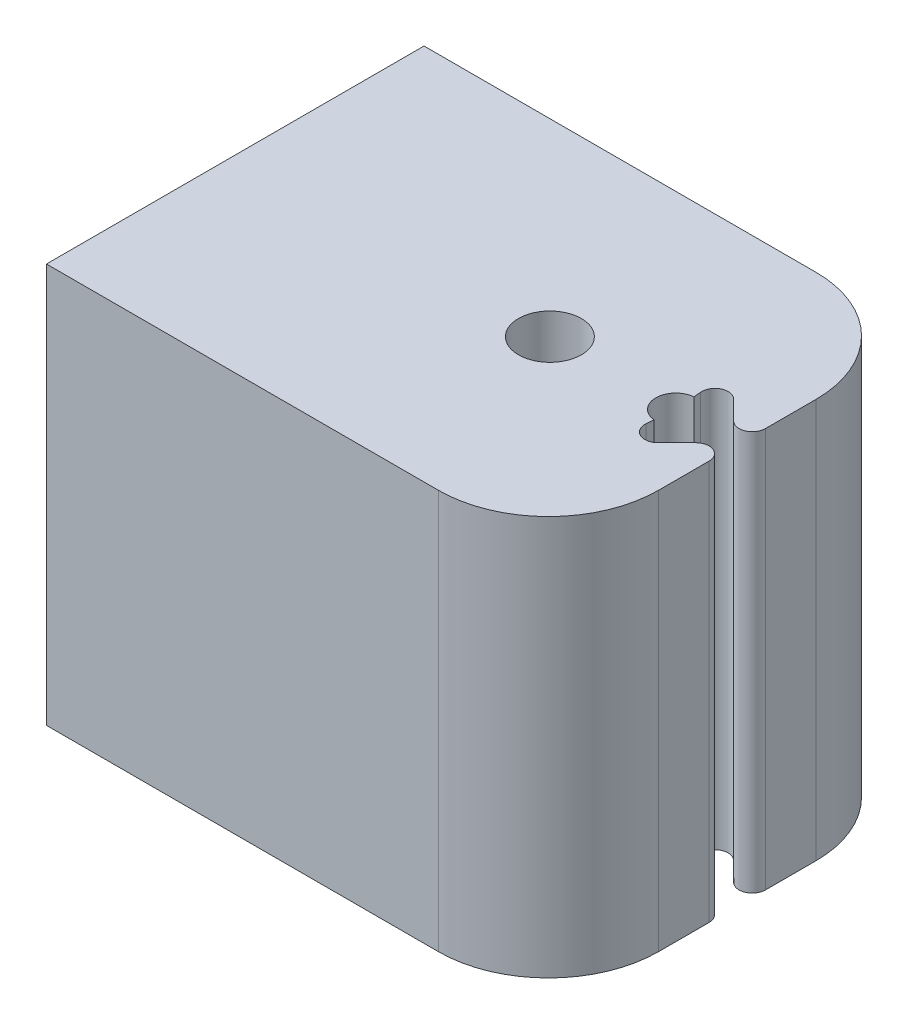
ISO-10303-21;
HEADER;
FILE_DESCRIPTION(('STEP AP214'),'2;1');
FILE_NAME('part.step','',(''),(''),'','','');
FILE_SCHEMA(('AUTOMOTIVE_DESIGN { 1 0 10303 214 1 1 1 1 }'));
ENDSEC;
DATA;
#1=APPLICATION_CONTEXT('core data for automotive mechanical design processes');
#2=APPLICATION_PROTOCOL_DEFINITION('international standard','automotive_design',2000,#1);
#3=PRODUCT_CONTEXT('',#1,'mechanical');
#4=PRODUCT('Part','Part','',(#3));
#5=PRODUCT_RELATED_PRODUCT_CATEGORY('part','',(#4));
#6=PRODUCT_DEFINITION_FORMATION('','',#4);
#7=PRODUCT_DEFINITION_CONTEXT('part definition',#1,'design');
#8=PRODUCT_DEFINITION('design','',#6,#7);
#9=PRODUCT_DEFINITION_SHAPE('','',#8);
#10=(LENGTH_UNIT() NAMED_UNIT(*) SI_UNIT(.MILLI.,.METRE.));
#11=(NAMED_UNIT(*) PLANE_ANGLE_UNIT() SI_UNIT($,.RADIAN.));
#12=(NAMED_UNIT(*) SI_UNIT($,.STERADIAN.) SOLID_ANGLE_UNIT());
#13=UNCERTAINTY_MEASURE_WITH_UNIT(LENGTH_MEASURE(1.E-05),#10,'distance_accuracy_value','');
#14=(GEOMETRIC_REPRESENTATION_CONTEXT(3) GLOBAL_UNCERTAINTY_ASSIGNED_CONTEXT((#13)) GLOBAL_UNIT_ASSIGNED_CONTEXT((#10,
#11,#12)) REPRESENTATION_CONTEXT('',''));
#15=CARTESIAN_POINT('',(0.,0.,0.));
#16=DIRECTION('',(0.,0.,1.));
#17=DIRECTION('',(1.,0.,0.));
#18=AXIS2_PLACEMENT_3D('',#15,#16,#17);
#19=CARTESIAN_POINT('',(-8.,12.7,0.));
#20=DIRECTION('',(0.,-1.,0.));
#21=DIRECTION('',(0.,0.,-1.));
#22=AXIS2_PLACEMENT_3D('',#19,#20,#21);
#23=CYLINDRICAL_SURFACE('',#22,1.);
#24=CARTESIAN_POINT('',(-8.,12.7,0.));
#25=DIRECTION('',(0.,1.,0.));
#26=DIRECTION('',(0.,0.,1.));
#27=AXIS2_PLACEMENT_3D('',#24,#25,#26);
#28=CIRCLE('',#27,1.);
#29=CARTESIAN_POINT('',(-8.,12.7,1.));
#30=VERTEX_POINT('',#29);
#31=EDGE_CURVE('E206',#30,#30,#28,.T.);
#32=ORIENTED_EDGE('',*,*,#31,.T.);
#33=EDGE_LOOP('',(#32));
#34=FACE_BOUND('',#33,.T.);
#35=CARTESIAN_POINT('',(-8.,0.,0.));
#36=DIRECTION('',(0.,1.,0.));
#37=DIRECTION('',(0.,0.,1.));
#38=AXIS2_PLACEMENT_3D('',#35,#36,#37);
#39=CIRCLE('',#38,1.);
#40=CARTESIAN_POINT('',(-8.,0.,1.));
#41=VERTEX_POINT('',#40);
#42=EDGE_CURVE('E347',#41,#41,#39,.T.);
#43=ORIENTED_EDGE('',*,*,#42,.F.);
#44=EDGE_LOOP('',(#43));
#45=FACE_BOUND('',#44,.T.);
#46=CARTESIAN_POINT('',(-8.,10.2229833462074,-1.));
#47=CARTESIAN_POINT('',(-8.02766298510654,10.2229814858018,-1.00000033749611));
#48=CARTESIAN_POINT('',(-8.05531226301823,10.2232800994947,-0.998851407375367));
#49=CARTESIAN_POINT('',(-8.11040403530357,10.2244590477456,-0.994271295395754));
#50=CARTESIAN_POINT('',(-8.13784656368709,10.2253392844169,-0.990840497572679));
#51=CARTESIAN_POINT('',(-8.21945317320884,10.2288171097205,-0.977175239382527));
#52=CARTESIAN_POINT('',(-8.27305646848221,10.2322520314881,-0.963567695172493));
#53=CARTESIAN_POINT('',(-8.37712467378197,10.24095422588,-0.927798076247997));
#54=CARTESIAN_POINT('',(-8.42758987821286,10.2462213263093,-0.905636805423836));
#55=CARTESIAN_POINT('',(-8.52411144864733,10.2579913447194,-0.853415378025865));
#56=CARTESIAN_POINT('',(-8.57016662789097,10.2644945939565,-0.823353103356932));
#57=CARTESIAN_POINT('',(-8.6575438819061,10.2781626239803,-0.755484471828068));
#58=CARTESIAN_POINT('',(-8.69875488624552,10.2853379102892,-0.717537268783975));
#59=CARTESIAN_POINT('',(-8.77430208948271,10.2994510439619,-0.635275780516229));
#60=CARTESIAN_POINT('',(-8.80863718946794,10.3063888532254,-0.59096047947883));
#61=CARTESIAN_POINT('',(-8.86991100161864,10.3193618228325,-0.49645689940169));
#62=CARTESIAN_POINT('',(-8.89673989598397,10.3253830468173,-0.446195340334473));
#63=CARTESIAN_POINT('',(-8.94152473419671,10.3357234625059,-0.341702590842918));
#64=CARTESIAN_POINT('',(-8.95948242429983,10.340042989147,-0.287472184083008));
#65=CARTESIAN_POINT('',(-8.98565899277744,10.3464190000513,-0.177744108525159));
#66=CARTESIAN_POINT('',(-8.99406767242282,10.348519529013,-0.122294322002856));
#67=CARTESIAN_POINT('',(-9.0015033715433,10.3503743815082,-0.0107327756816777));
#68=CARTESIAN_POINT('',(-9.00053157019234,10.3501289999344,0.0453789000287075));
#69=CARTESIAN_POINT('',(-8.98937003631455,10.3473523736574,0.155352492972098));
#70=CARTESIAN_POINT('',(-8.97938538340052,10.3448719867736,0.209236701739857));
#71=CARTESIAN_POINT('',(-8.95081132081725,10.337963306365,0.314538711084342));
#72=CARTESIAN_POINT('',(-8.93222153043142,10.3335349266556,0.36595640242399));
#73=CARTESIAN_POINT('',(-8.88679871932935,10.323149977618,0.465407286024541));
#74=CARTESIAN_POINT('',(-8.85989260576716,10.3171799382756,0.51340562960225));
#75=CARTESIAN_POINT('',(-8.79865687016653,10.3043594554192,0.604276631230016));
#76=CARTESIAN_POINT('',(-8.76432612974678,10.297508879332,0.64714851556229));
#77=CARTESIAN_POINT('',(-8.68812108791869,10.2834556602287,0.727769389708492));
#78=CARTESIAN_POINT('',(-8.64606836346019,10.2762485047769,0.765349103054129));
#79=CARTESIAN_POINT('',(-8.55617013307227,10.2624616828401,0.83296957518624));
#80=CARTESIAN_POINT('',(-8.50832304671644,10.2558821884299,0.863008270245064));
#81=CARTESIAN_POINT('',(-8.40785440217623,10.2440781358633,0.914804709285964));
#82=CARTESIAN_POINT('',(-8.35520853510392,10.2388610600914,0.936517017887271));
#83=CARTESIAN_POINT('',(-8.24688307158172,10.2304705880706,0.970702351849831));
#84=CARTESIAN_POINT('',(-8.19120814485016,10.2272941376144,0.983189189212134));
#85=CARTESIAN_POINT('',(-8.1125426192411,10.2245529068152,0.99390463515094));
#86=CARTESIAN_POINT('',(-8.09008029678682,10.2239652311086,0.99619079096671));
#87=CARTESIAN_POINT('',(-8.04508221009068,10.2231806248897,0.999236757697396));
#88=CARTESIAN_POINT('',(-8.02254662404471,10.2229830621946,0.999999038096048));
#89=CARTESIAN_POINT('',(-8.,10.2229833462074,1.));
#90=B_SPLINE_CURVE_WITH_KNOTS('',3,(#46,#47,#48,#49,#50,#51,#52,#53,#54,#55,#56,#57,#58,#59,#60,
#61,#62,#63,#64,#65,#66,#67,#68,#69,#70,#71,#72,#73,#74,#75,#76,#77,#78,#79,#80,#81,#82,#83,#84,
#85,#86,#87,#88,#89),.UNSPECIFIED.,.F.,.F.,(4,2,2,2,2,2,2,2,2,2,2,2,2,2,2,2,2,2,2,2,2,4),(0.,
0.082936530339771,0.165859106084653,0.331229963080318,0.496585282091501,0.661984974726752,
0.830641897427977,0.999325753539194,1.17036187098235,1.34136430732425,1.50890481515325,
1.67642426256639,1.84022545479276,2.00403389475838,2.16932509450377,2.33464120964329,
2.50441429534543,2.67423379180968,2.84496720161068,3.01544447539986,3.08315848722648,
3.15076267731672),.UNSPECIFIED.);
#91=CARTESIAN_POINT('',(-8.,10.2229833462074,-1.));
#92=VERTEX_POINT('',#91);
#93=CARTESIAN_POINT('',(-8.,10.2229833462074,1.));
#94=VERTEX_POINT('',#93);
#95=EDGE_CURVE('E307',#92,#94,#90,.T.);
#96=ORIENTED_EDGE('',*,*,#95,.F.);
#97=DIRECTION('',(0.,-1.,0.));
#98=VECTOR('',#97,1.);
#99=CARTESIAN_POINT('',(-8.,12.7,-1.));
#100=LINE('',#99,#98);
#101=CARTESIAN_POINT('',(-8.,2.47701665379258,-1.));
#102=VERTEX_POINT('',#101);
#103=EDGE_CURVE('E11',#92,#102,#100,.T.);
#104=ORIENTED_EDGE('',*,*,#103,.T.);
#105=CARTESIAN_POINT('',(-8.,2.47701665379258,1.));
#106=CARTESIAN_POINT('',(-8.02766298510654,2.47701851419823,1.00000033749611));
#107=CARTESIAN_POINT('',(-8.05531226301823,2.47671990050529,0.998851407375368));
#108=CARTESIAN_POINT('',(-8.11040403530357,2.47554095225441,0.994271295395756));
#109=CARTESIAN_POINT('',(-8.13784656368709,2.47466071558313,0.990840497572681));
#110=CARTESIAN_POINT('',(-8.21945317320884,2.47118289027946,0.977175239382528));
#111=CARTESIAN_POINT('',(-8.27305646848221,2.46774796851191,0.963567695172495));
#112=CARTESIAN_POINT('',(-8.37712467378197,2.45904577411997,0.927798076247999));
#113=CARTESIAN_POINT('',(-8.42758987821286,2.4537786736907,0.905636805423838));
#114=CARTESIAN_POINT('',(-8.52411144864733,2.44200865528061,0.853415378025867));
#115=CARTESIAN_POINT('',(-8.57016662789097,2.43550540604353,0.823353103356934));
#116=CARTESIAN_POINT('',(-8.6575438819061,2.42183737601975,0.75548447182807));
#117=CARTESIAN_POINT('',(-8.69875488624552,2.41466208971084,0.717537268783977));
#118=CARTESIAN_POINT('',(-8.77430208948271,2.40054895603806,0.635275780516231));
#119=CARTESIAN_POINT('',(-8.80863718946794,2.39361114677463,0.590960479478832));
#120=CARTESIAN_POINT('',(-8.86991100161864,2.38063817716752,0.496456899401692));
#121=CARTESIAN_POINT('',(-8.89673989598397,2.3746169531827,0.446195340334475));
#122=CARTESIAN_POINT('',(-8.94152473419671,2.36427653749411,0.34170259084292));
#123=CARTESIAN_POINT('',(-8.95948242429983,2.35995701085299,0.28747218408301));
#124=CARTESIAN_POINT('',(-8.98565899277744,2.35358099994872,0.17774410852516));
#125=CARTESIAN_POINT('',(-8.99406767242282,2.35148047098699,0.122294322002858));
#126=CARTESIAN_POINT('',(-9.0015033715433,2.34962561849184,0.0107327756816795));
#127=CARTESIAN_POINT('',(-9.00053157019234,2.34987100006555,-0.0453789000287058));
#128=CARTESIAN_POINT('',(-8.98937003631455,2.35264762634264,-0.155352492972096));
#129=CARTESIAN_POINT('',(-8.97938538340052,2.35512801322639,-0.209236701739855));
#130=CARTESIAN_POINT('',(-8.95081132081725,2.36203669363504,-0.31453871108434));
#131=CARTESIAN_POINT('',(-8.93222153043142,2.36646507334444,-0.365956402423988));
#132=CARTESIAN_POINT('',(-8.88679871932935,2.37685002238202,-0.465407286024539));
#133=CARTESIAN_POINT('',(-8.85989260576716,2.38282006172445,-0.513405629602248));
#134=CARTESIAN_POINT('',(-8.79865687016653,2.39564054458081,-0.604276631230014));
#135=CARTESIAN_POINT('',(-8.76432612974678,2.40249112066802,-0.647148515562289));
#136=CARTESIAN_POINT('',(-8.68812108791869,2.41654433977135,-0.727769389708491));
#137=CARTESIAN_POINT('',(-8.64606836346019,2.42375149522315,-0.765349103054127));
#138=CARTESIAN_POINT('',(-8.55617013307227,2.43753831715994,-0.832969575186238));
#139=CARTESIAN_POINT('',(-8.50832304671644,2.44411781157007,-0.863008270245062));
#140=CARTESIAN_POINT('',(-8.40785440217623,2.45592186413675,-0.914804709285962));
#141=CARTESIAN_POINT('',(-8.35520853510392,2.46113893990863,-0.93651701788727));
#142=CARTESIAN_POINT('',(-8.24688307158172,2.46952941192945,-0.970702351849829));
#143=CARTESIAN_POINT('',(-8.19120814485016,2.47270586238565,-0.983189189212132));
#144=CARTESIAN_POINT('',(-8.1125426192411,2.47544709318476,-0.993904635150938));
#145=CARTESIAN_POINT('',(-8.09008029678682,2.4760347688914,-0.996190790966708));
#146=CARTESIAN_POINT('',(-8.04508221009068,2.47681937511026,-0.999236757697394));
#147=CARTESIAN_POINT('',(-8.02254662404471,2.47701693780539,-0.999999038096046));
#148=CARTESIAN_POINT('',(-8.,2.47701665379258,-1.));
#149=B_SPLINE_CURVE_WITH_KNOTS('',3,(#105,#106,#107,#108,#109,#110,#111,#112,#113,#114,#115,
#116,#117,#118,#119,#120,#121,#122,#123,#124,#125,#126,#127,#128,#129,#130,#131,#132,#133,#134,
#135,#136,#137,#138,#139,#140,#141,#142,#143,#144,#145,#146,#147,#148),.UNSPECIFIED.,.F.,.F.,(4,
2,2,2,2,2,2,2,2,2,2,2,2,2,2,2,2,2,2,2,2,4),(0.,0.082936530339771,0.165859106084653,
0.331229963080318,0.496585282091501,0.661984974726752,0.830641897427976,0.999325753539194,
1.17036187098235,1.34136430732425,1.50890481515325,1.67642426256639,1.84022545479276,
2.00403389475838,2.16932509450377,2.33464120964329,2.50441429534543,2.67423379180968,
2.84496720161068,3.01544447539986,3.08315848722648,3.15076267731672),.UNSPECIFIED.);
#150=CARTESIAN_POINT('',(-8.,2.47701665379258,1.));
#151=VERTEX_POINT('',#150);
#152=EDGE_CURVE('E48',#151,#102,#149,.T.);
#153=ORIENTED_EDGE('',*,*,#152,.F.);
#154=DIRECTION('',(0.,-1.,0.));
#155=VECTOR('',#154,1.);
#156=CARTESIAN_POINT('',(-8.,12.7,1.));
#157=LINE('',#156,#155);
#158=EDGE_CURVE('E303',#151,#94,#157,.F.);
#159=ORIENTED_EDGE('',*,*,#158,.T.);
#160=EDGE_LOOP('',(#96,#104,#153,#159));
#161=FACE_BOUND('',#160,.T.);
#162=ADVANCED_FACE('F39',(#34,#45,#161),#23,.F.);
#163=CARTESIAN_POINT('',(-4.,12.7,0.));
#164=DIRECTION('',(0.,1.,0.));
#165=DIRECTION('',(0.,0.,1.));
#166=AXIS2_PLACEMENT_3D('',#163,#164,#165);
#167=PLANE('',#166);
#168=CARTESIAN_POINT('',(-4.,12.7,0.));
#169=DIRECTION('',(0.,-1.,0.));
#170=DIRECTION('',(0.,0.,1.));
#171=AXIS2_PLACEMENT_3D('',#168,#169,#170);
#172=CIRCLE('',#171,0.634999999999999);
#173=CARTESIAN_POINT('',(-4.05534389664477,12.7,0.632583633288258));
#174=VERTEX_POINT('',#173);
#175=CARTESIAN_POINT('',(-4.05534389664477,12.7,-0.632583633288257));
#176=VERTEX_POINT('',#175);
#177=EDGE_CURVE('E249',#174,#176,#172,.T.);
#178=ORIENTED_EDGE('',*,*,#177,.T.);
#179=DIRECTION('',(-0.0871557427476667,0.,-0.996194698091745));
#180=VECTOR('',#179,1.);
#181=CARTESIAN_POINT('',(-4.05534389664477,12.7,-0.632583633288257));
#182=LINE('',#181,#180);
#183=CARTESIAN_POINT('',(-4.07584445948414,12.7,-0.866906138778301));
#184=VERTEX_POINT('',#183);
#185=EDGE_CURVE('E129',#176,#184,#182,.T.);
#186=ORIENTED_EDGE('',*,*,#185,.T.);
#187=CARTESIAN_POINT('',(-3.65806528884882,12.7,-0.903457080066159));
#188=DIRECTION('',(0.,-1.,0.));
#189=DIRECTION('',(0.,0.,-1.));
#190=AXIS2_PLACEMENT_3D('',#187,#188,#189);
#191=CIRCLE('',#190,0.419375019196146);
#192=CARTESIAN_POINT('',(-3.36152236891499,12.7,-1.2));
#193=VERTEX_POINT('',#192);
#194=EDGE_CURVE('E375',#184,#193,#191,.T.);
#195=ORIENTED_EDGE('',*,*,#194,.T.);
#196=DIRECTION('',(0.707106781186565,0.,0.70710678118653));
#197=VECTOR('',#196,1.);
#198=CARTESIAN_POINT('',(-3.36152236891499,12.7,-1.2));
#199=LINE('',#198,#197);
#200=CARTESIAN_POINT('',(-2.76152236891496,12.7,-0.6));
#201=VERTEX_POINT('',#200);
#202=EDGE_CURVE('E378',#193,#201,#199,.T.);
#203=ORIENTED_EDGE('',*,*,#202,.T.);
#204=CARTESIAN_POINT('',(-2.46497944898113,12.7,-0.89654291993384));
#205=DIRECTION('',(0.,1.,0.));
#206=DIRECTION('',(0.,0.,1.));
#207=AXIS2_PLACEMENT_3D('',#204,#205,#206);
#208=CIRCLE('',#207,0.419375019196146);
#209=CARTESIAN_POINT('',(-2.04560442978499,12.7,-0.89654291993384));
#210=VERTEX_POINT('',#209);
#211=EDGE_CURVE('E381',#201,#210,#208,.T.);
#212=ORIENTED_EDGE('',*,*,#211,.T.);
#213=DIRECTION('',(0.,0.,-1.));
#214=VECTOR('',#213,1.);
#215=CARTESIAN_POINT('',(-2.04560442978499,12.7,-0.89654291993384));
#216=LINE('',#215,#214);
#217=CARTESIAN_POINT('',(-2.04560442978499,12.7,-2.5));
#218=VERTEX_POINT('',#217);
#219=EDGE_CURVE('E384',#210,#218,#216,.T.);
#220=ORIENTED_EDGE('',*,*,#219,.T.);
#221=CARTESIAN_POINT('',(-5.54560442978499,12.7,-2.5));
#222=DIRECTION('',(0.,1.,0.));
#223=DIRECTION('',(0.,0.,1.));
#224=AXIS2_PLACEMENT_3D('',#221,#222,#223);
#225=CIRCLE('',#224,3.5);
#226=CARTESIAN_POINT('',(-5.54560442978499,12.7,-6.));
#227=VERTEX_POINT('',#226);
#228=EDGE_CURVE('E387',#218,#227,#225,.T.);
#229=ORIENTED_EDGE('',*,*,#228,.T.);
#230=DIRECTION('',(-1.,0.,0.));
#231=VECTOR('',#230,1.);
#232=CARTESIAN_POINT('',(-5.54560442978499,12.7,-6.));
#233=LINE('',#232,#231);
#234=CARTESIAN_POINT('',(-18.,12.7,-6.));
#235=VERTEX_POINT('',#234);
#236=EDGE_CURVE('E390',#227,#235,#233,.T.);
#237=ORIENTED_EDGE('',*,*,#236,.T.);
#238=DIRECTION('',(0.,0.,1.));
#239=VECTOR('',#238,1.);
#240=CARTESIAN_POINT('',(-18.,12.7,-6.));
#241=LINE('',#240,#239);
#242=CARTESIAN_POINT('',(-18.,12.7,6.));
#243=VERTEX_POINT('',#242);
#244=EDGE_CURVE('E393',#235,#243,#241,.T.);
#245=ORIENTED_EDGE('',*,*,#244,.T.);
#246=DIRECTION('',(1.,0.,0.));
#247=VECTOR('',#246,1.);
#248=CARTESIAN_POINT('',(-18.,12.7,6.));
#249=LINE('',#248,#247);
#250=CARTESIAN_POINT('',(-5.54560442978499,12.7,6.));
#251=VERTEX_POINT('',#250);
#252=EDGE_CURVE('E396',#243,#251,#249,.T.);
#253=ORIENTED_EDGE('',*,*,#252,.T.);
#254=CARTESIAN_POINT('',(-5.54560442978499,12.7,2.5));
#255=DIRECTION('',(0.,1.,0.));
#256=DIRECTION('',(0.,0.,1.));
#257=AXIS2_PLACEMENT_3D('',#254,#255,#256);
#258=CIRCLE('',#257,3.5);
#259=CARTESIAN_POINT('',(-2.04560442978499,12.7,2.5));
#260=VERTEX_POINT('',#259);
#261=EDGE_CURVE('E399',#251,#260,#258,.T.);
#262=ORIENTED_EDGE('',*,*,#261,.T.);
#263=DIRECTION('',(0.,0.,-1.));
#264=VECTOR('',#263,1.);
#265=CARTESIAN_POINT('',(-2.04560442978499,12.7,0.896542919933841));
#266=LINE('',#265,#264);
#267=CARTESIAN_POINT('',(-2.04560442978499,12.7,0.896542919933841));
#268=VERTEX_POINT('',#267);
#269=EDGE_CURVE('E402',#260,#268,#266,.T.);
#270=ORIENTED_EDGE('',*,*,#269,.T.);
#271=CARTESIAN_POINT('',(-2.46497944898113,12.7,0.896542919933841));
#272=DIRECTION('',(0.,1.,0.));
#273=DIRECTION('',(0.,0.,-1.));
#274=AXIS2_PLACEMENT_3D('',#271,#272,#273);
#275=CIRCLE('',#274,0.419375019196146);
#276=CARTESIAN_POINT('',(-2.76152236891496,12.7,0.6));
#277=VERTEX_POINT('',#276);
#278=EDGE_CURVE('E176',#268,#277,#275,.T.);
#279=ORIENTED_EDGE('',*,*,#278,.T.);
#280=DIRECTION('',(-0.707106781186565,0.,0.70710678118653));
#281=VECTOR('',#280,1.);
#282=CARTESIAN_POINT('',(-3.36152236891499,12.7,1.2));
#283=LINE('',#282,#281);
#284=CARTESIAN_POINT('',(-3.36152236891499,12.7,1.2));
#285=VERTEX_POINT('',#284);
#286=EDGE_CURVE('E168',#277,#285,#283,.T.);
#287=ORIENTED_EDGE('',*,*,#286,.T.);
#288=CARTESIAN_POINT('',(-3.65806528884882,12.7,0.903457080066159));
#289=DIRECTION('',(0.,-1.,0.));
#290=DIRECTION('',(0.,0.,1.));
#291=AXIS2_PLACEMENT_3D('',#288,#289,#290);
#292=CIRCLE('',#291,0.419375019196146);
#293=CARTESIAN_POINT('',(-4.07584445948414,12.7,0.866906138778302));
#294=VERTEX_POINT('',#293);
#295=EDGE_CURVE('E173',#285,#294,#292,.T.);
#296=ORIENTED_EDGE('',*,*,#295,.T.);
#297=DIRECTION('',(0.0871557427476667,0.,-0.996194698091745));
#298=VECTOR('',#297,1.);
#299=CARTESIAN_POINT('',(-4.05534389664477,12.7,0.632583633288258));
#300=LINE('',#299,#298);
#301=EDGE_CURVE('E63',#294,#174,#300,.T.);
#302=ORIENTED_EDGE('',*,*,#301,.T.);
#303=EDGE_LOOP('',(#178,#186,#195,#203,#212,#220,#229,#237,#245,#253,#262,#270,#279,#287,#296,#302));
#304=FACE_BOUND('',#303,.T.);
#305=ORIENTED_EDGE('',*,*,#31,.F.);
#306=EDGE_LOOP('',(#305));
#307=FACE_BOUND('',#306,.T.);
#308=ADVANCED_FACE('F170',(#304,#307),#167,.T.);
#309=CARTESIAN_POINT('',(-4.,0.,0.));
#310=DIRECTION('',(0.,1.,0.));
#311=DIRECTION('',(0.,0.,1.));
#312=AXIS2_PLACEMENT_3D('',#309,#310,#311);
#313=PLANE('',#312);
#314=CARTESIAN_POINT('',(-4.,0.,0.));
#315=DIRECTION('',(0.,-1.,0.));
#316=DIRECTION('',(0.,0.,1.));
#317=AXIS2_PLACEMENT_3D('',#314,#315,#316);
#318=CIRCLE('',#317,0.634999999999999);
#319=CARTESIAN_POINT('',(-4.05534389664477,0.,0.632583633288258));
#320=VERTEX_POINT('',#319);
#321=CARTESIAN_POINT('',(-4.05534389664477,0.,-0.632583633288257));
#322=VERTEX_POINT('',#321);
#323=EDGE_CURVE('E201',#320,#322,#318,.T.);
#324=ORIENTED_EDGE('',*,*,#323,.F.);
#325=DIRECTION('',(0.0871557427476667,0.,-0.996194698091745));
#326=VECTOR('',#325,1.);
#327=CARTESIAN_POINT('',(-4.05534389664477,0.,0.632583633288258));
#328=LINE('',#327,#326);
#329=CARTESIAN_POINT('',(-4.07584445948414,0.,0.866906138778302));
#330=VERTEX_POINT('',#329);
#331=EDGE_CURVE('E120',#330,#320,#328,.T.);
#332=ORIENTED_EDGE('',*,*,#331,.F.);
#333=CARTESIAN_POINT('',(-3.65806528884882,0.,0.903457080066159));
#334=DIRECTION('',(0.,-1.,0.));
#335=DIRECTION('',(0.,0.,1.));
#336=AXIS2_PLACEMENT_3D('',#333,#334,#335);
#337=CIRCLE('',#336,0.419375019196146);
#338=CARTESIAN_POINT('',(-3.36152236891499,0.,1.2));
#339=VERTEX_POINT('',#338);
#340=EDGE_CURVE('E244',#339,#330,#337,.T.);
#341=ORIENTED_EDGE('',*,*,#340,.F.);
#342=DIRECTION('',(-0.707106781186565,0.,0.70710678118653));
#343=VECTOR('',#342,1.);
#344=CARTESIAN_POINT('',(-3.36152236891499,0.,1.2));
#345=LINE('',#344,#343);
#346=CARTESIAN_POINT('',(-2.76152236891496,0.,0.6));
#347=VERTEX_POINT('',#346);
#348=EDGE_CURVE('E186',#347,#339,#345,.T.);
#349=ORIENTED_EDGE('',*,*,#348,.F.);
#350=CARTESIAN_POINT('',(-2.46497944898113,0.,0.896542919933841));
#351=DIRECTION('',(0.,1.,0.));
#352=DIRECTION('',(0.,0.,-1.));
#353=AXIS2_PLACEMENT_3D('',#350,#351,#352);
#354=CIRCLE('',#353,0.419375019196146);
#355=CARTESIAN_POINT('',(-2.04560442978499,0.,0.896542919933841));
#356=VERTEX_POINT('',#355);
#357=EDGE_CURVE('E239',#356,#347,#354,.T.);
#358=ORIENTED_EDGE('',*,*,#357,.F.);
#359=DIRECTION('',(0.,0.,-1.));
#360=VECTOR('',#359,1.);
#361=CARTESIAN_POINT('',(-2.04560442978499,0.,0.896542919933841));
#362=LINE('',#361,#360);
#363=CARTESIAN_POINT('',(-2.04560442978499,0.,2.5));
#364=VERTEX_POINT('',#363);
#365=EDGE_CURVE('E236',#364,#356,#362,.T.);
#366=ORIENTED_EDGE('',*,*,#365,.F.);
#367=CARTESIAN_POINT('',(-5.54560442978499,0.,2.5));
#368=DIRECTION('',(0.,1.,0.));
#369=DIRECTION('',(0.,0.,1.));
#370=AXIS2_PLACEMENT_3D('',#367,#368,#369);
#371=CIRCLE('',#370,3.5);
#372=CARTESIAN_POINT('',(-5.54560442978499,0.,6.));
#373=VERTEX_POINT('',#372);
#374=EDGE_CURVE('E233',#373,#364,#371,.T.);
#375=ORIENTED_EDGE('',*,*,#374,.F.);
#376=DIRECTION('',(1.,0.,0.));
#377=VECTOR('',#376,1.);
#378=CARTESIAN_POINT('',(-18.,0.,6.));
#379=LINE('',#378,#377);
#380=CARTESIAN_POINT('',(-18.,0.,6.));
#381=VERTEX_POINT('',#380);
#382=EDGE_CURVE('E230',#381,#373,#379,.T.);
#383=ORIENTED_EDGE('',*,*,#382,.F.);
#384=DIRECTION('',(0.,0.,1.));
#385=VECTOR('',#384,1.);
#386=CARTESIAN_POINT('',(-18.,0.,-6.));
#387=LINE('',#386,#385);
#388=CARTESIAN_POINT('',(-18.,0.,-6.));
#389=VERTEX_POINT('',#388);
#390=EDGE_CURVE('E227',#389,#381,#387,.T.);
#391=ORIENTED_EDGE('',*,*,#390,.F.);
#392=DIRECTION('',(-1.,0.,0.));
#393=VECTOR('',#392,1.);
#394=CARTESIAN_POINT('',(-5.54560442978499,0.,-6.));
#395=LINE('',#394,#393);
#396=CARTESIAN_POINT('',(-5.54560442978499,0.,-6.));
#397=VERTEX_POINT('',#396);
#398=EDGE_CURVE('E224',#397,#389,#395,.T.);
#399=ORIENTED_EDGE('',*,*,#398,.F.);
#400=CARTESIAN_POINT('',(-5.54560442978499,0.,-2.5));
#401=DIRECTION('',(0.,1.,0.));
#402=DIRECTION('',(0.,0.,1.));
#403=AXIS2_PLACEMENT_3D('',#400,#401,#402);
#404=CIRCLE('',#403,3.5);
#405=CARTESIAN_POINT('',(-2.04560442978499,0.,-2.5));
#406=VERTEX_POINT('',#405);
#407=EDGE_CURVE('E221',#406,#397,#404,.T.);
#408=ORIENTED_EDGE('',*,*,#407,.F.);
#409=DIRECTION('',(0.,0.,-1.));
#410=VECTOR('',#409,1.);
#411=CARTESIAN_POINT('',(-2.04560442978499,0.,-0.89654291993384));
#412=LINE('',#411,#410);
#413=CARTESIAN_POINT('',(-2.04560442978499,0.,-0.89654291993384));
#414=VERTEX_POINT('',#413);
#415=EDGE_CURVE('E218',#414,#406,#412,.T.);
#416=ORIENTED_EDGE('',*,*,#415,.F.);
#417=CARTESIAN_POINT('',(-2.46497944898113,0.,-0.89654291993384));
#418=DIRECTION('',(0.,1.,0.));
#419=DIRECTION('',(0.,0.,1.));
#420=AXIS2_PLACEMENT_3D('',#417,#418,#419);
#421=CIRCLE('',#420,0.419375019196146);
#422=CARTESIAN_POINT('',(-2.76152236891496,0.,-0.6));
#423=VERTEX_POINT('',#422);
#424=EDGE_CURVE('E215',#423,#414,#421,.T.);
#425=ORIENTED_EDGE('',*,*,#424,.F.);
#426=DIRECTION('',(0.707106781186565,0.,0.70710678118653));
#427=VECTOR('',#426,1.);
#428=CARTESIAN_POINT('',(-3.36152236891499,0.,-1.2));
#429=LINE('',#428,#427);
#430=CARTESIAN_POINT('',(-3.36152236891499,0.,-1.2));
#431=VERTEX_POINT('',#430);
#432=EDGE_CURVE('E212',#431,#423,#429,.T.);
#433=ORIENTED_EDGE('',*,*,#432,.F.);
#434=CARTESIAN_POINT('',(-3.65806528884882,0.,-0.903457080066159));
#435=DIRECTION('',(0.,-1.,0.));
#436=DIRECTION('',(0.,0.,-1.));
#437=AXIS2_PLACEMENT_3D('',#434,#435,#436);
#438=CIRCLE('',#437,0.419375019196146);
#439=CARTESIAN_POINT('',(-4.07584445948414,0.,-0.866906138778301));
#440=VERTEX_POINT('',#439);
#441=EDGE_CURVE('E209',#440,#431,#438,.T.);
#442=ORIENTED_EDGE('',*,*,#441,.F.);
#443=DIRECTION('',(-0.0871557427476667,0.,-0.996194698091745));
#444=VECTOR('',#443,1.);
#445=CARTESIAN_POINT('',(-4.05534389664477,0.,-0.632583633288257));
#446=LINE('',#445,#444);
#447=EDGE_CURVE('E205',#322,#440,#446,.T.);
#448=ORIENTED_EDGE('',*,*,#447,.F.);
#449=EDGE_LOOP('',(#324,#332,#341,#349,#358,#366,#375,#383,#391,#399,#408,#416,#425,#433,#442,#448));
#450=FACE_BOUND('',#449,.T.);
#451=ORIENTED_EDGE('',*,*,#42,.T.);
#452=EDGE_LOOP('',(#451));
#453=FACE_BOUND('',#452,.T.);
#454=ADVANCED_FACE('F340',(#450,#453),#313,.F.);
#455=CARTESIAN_POINT('',(-4.,12.7,0.));
#456=DIRECTION('',(0.,-1.,0.));
#457=DIRECTION('',(0.,0.,-1.));
#458=AXIS2_PLACEMENT_3D('',#455,#456,#457);
#459=CYLINDRICAL_SURFACE('',#458,0.634999999999999);
#460=ORIENTED_EDGE('',*,*,#323,.T.);
#461=DIRECTION('',(0.,-1.,0.));
#462=VECTOR('',#461,1.);
#463=CARTESIAN_POINT('',(-4.05534389664477,12.7,-0.632583633288257));
#464=LINE('',#463,#462);
#465=EDGE_CURVE('E300',#176,#322,#464,.T.);
#466=ORIENTED_EDGE('',*,*,#465,.F.);
#467=ORIENTED_EDGE('',*,*,#177,.F.);
#468=DIRECTION('',(0.,-1.,0.));
#469=VECTOR('',#468,1.);
#470=CARTESIAN_POINT('',(-4.05534389664477,12.7,0.632583633288258));
#471=LINE('',#470,#469);
#472=EDGE_CURVE('E197',#174,#320,#471,.T.);
#473=ORIENTED_EDGE('',*,*,#472,.T.);
#474=EDGE_LOOP('',(#460,#466,#467,#473));
#475=FACE_BOUND('',#474,.T.);
#476=ADVANCED_FACE('F41',(#475),#459,.F.);
#477=CARTESIAN_POINT('',(-4.05534389664477,12.7,-0.632583633288257));
#478=DIRECTION('',(-0.996194698091745,0.,0.0871557427476667));
#479=DIRECTION('',(0.0871557427476667,0.,0.996194698091745));
#480=AXIS2_PLACEMENT_3D('',#477,#478,#479);
#481=PLANE('',#480);
#482=ORIENTED_EDGE('',*,*,#447,.T.);
#483=DIRECTION('',(0.,-1.,0.));
#484=VECTOR('',#483,1.);
#485=CARTESIAN_POINT('',(-4.07584445948414,12.7,-0.866906138778301));
#486=LINE('',#485,#484);
#487=EDGE_CURVE('E296',#184,#440,#486,.T.);
#488=ORIENTED_EDGE('',*,*,#487,.F.);
#489=ORIENTED_EDGE('',*,*,#185,.F.);
#490=ORIENTED_EDGE('',*,*,#465,.T.);
#491=EDGE_LOOP('',(#482,#488,#489,#490));
#492=FACE_BOUND('',#491,.T.);
#493=ADVANCED_FACE('F423',(#492),#481,.F.);
#494=CARTESIAN_POINT('',(-3.65806528884882,12.7,-0.903457080066159));
#495=DIRECTION('',(0.,-1.,0.));
#496=DIRECTION('',(0.,0.,-1.));
#497=AXIS2_PLACEMENT_3D('',#494,#495,#496);
#498=CYLINDRICAL_SURFACE('',#497,0.419375019196146);
#499=ORIENTED_EDGE('',*,*,#441,.T.);
#500=DIRECTION('',(0.,-1.,0.));
#501=VECTOR('',#500,1.);
#502=CARTESIAN_POINT('',(-3.36152236891499,12.7,-1.2));
#503=LINE('',#502,#501);
#504=EDGE_CURVE('E292',#193,#431,#503,.T.);
#505=ORIENTED_EDGE('',*,*,#504,.F.);
#506=ORIENTED_EDGE('',*,*,#194,.F.);
#507=ORIENTED_EDGE('',*,*,#487,.T.);
#508=EDGE_LOOP('',(#499,#505,#506,#507));
#509=FACE_BOUND('',#508,.T.);
#510=ADVANCED_FACE('F426',(#509),#498,.F.);
#511=CARTESIAN_POINT('',(-3.36152236891499,12.7,-1.2));
#512=DIRECTION('',(0.707106781186529,0.,-0.707106781186565));
#513=DIRECTION('',(-0.707106781186566,0.,-0.70710678118653));
#514=AXIS2_PLACEMENT_3D('',#511,#512,#513);
#515=PLANE('',#514);
#516=ORIENTED_EDGE('',*,*,#432,.T.);
#517=DIRECTION('',(0.,-1.,0.));
#518=VECTOR('',#517,1.);
#519=CARTESIAN_POINT('',(-2.76152236891496,12.7,-0.6));
#520=LINE('',#519,#518);
#521=EDGE_CURVE('E288',#201,#423,#520,.T.);
#522=ORIENTED_EDGE('',*,*,#521,.F.);
#523=ORIENTED_EDGE('',*,*,#202,.F.);
#524=ORIENTED_EDGE('',*,*,#504,.T.);
#525=EDGE_LOOP('',(#516,#522,#523,#524));
#526=FACE_BOUND('',#525,.T.);
#527=ADVANCED_FACE('F431',(#526),#515,.F.);
#528=CARTESIAN_POINT('',(-2.46497944898113,12.7,-0.89654291993384));
#529=DIRECTION('',(0.,-1.,0.));
#530=DIRECTION('',(0.,0.,-1.));
#531=AXIS2_PLACEMENT_3D('',#528,#529,#530);
#532=CYLINDRICAL_SURFACE('',#531,0.419375019196146);
#533=ORIENTED_EDGE('',*,*,#424,.T.);
#534=DIRECTION('',(0.,-1.,0.));
#535=VECTOR('',#534,1.);
#536=CARTESIAN_POINT('',(-2.04560442978499,12.7,-0.89654291993384));
#537=LINE('',#536,#535);
#538=EDGE_CURVE('E284',#210,#414,#537,.T.);
#539=ORIENTED_EDGE('',*,*,#538,.F.);
#540=ORIENTED_EDGE('',*,*,#211,.F.);
#541=ORIENTED_EDGE('',*,*,#521,.T.);
#542=EDGE_LOOP('',(#533,#539,#540,#541));
#543=FACE_BOUND('',#542,.T.);
#544=ADVANCED_FACE('F437',(#543),#532,.T.);
#545=CARTESIAN_POINT('',(-2.04560442978499,12.7,-0.89654291993384));
#546=DIRECTION('',(-1.,0.,0.));
#547=DIRECTION('',(0.,0.,1.));
#548=AXIS2_PLACEMENT_3D('',#545,#546,#547);
#549=PLANE('',#548);
#550=ORIENTED_EDGE('',*,*,#415,.T.);
#551=DIRECTION('',(0.,-1.,0.));
#552=VECTOR('',#551,1.);
#553=CARTESIAN_POINT('',(-2.04560442978499,12.7,-2.5));
#554=LINE('',#553,#552);
#555=EDGE_CURVE('E280',#218,#406,#554,.T.);
#556=ORIENTED_EDGE('',*,*,#555,.F.);
#557=ORIENTED_EDGE('',*,*,#219,.F.);
#558=ORIENTED_EDGE('',*,*,#538,.T.);
#559=EDGE_LOOP('',(#550,#556,#557,#558));
#560=FACE_BOUND('',#559,.T.);
#561=ADVANCED_FACE('F441',(#560),#549,.F.);
#562=CARTESIAN_POINT('',(-5.54560442978499,12.7,-2.5));
#563=DIRECTION('',(0.,-1.,0.));
#564=DIRECTION('',(0.,0.,-1.));
#565=AXIS2_PLACEMENT_3D('',#562,#563,#564);
#566=CYLINDRICAL_SURFACE('',#565,3.5);
#567=ORIENTED_EDGE('',*,*,#407,.T.);
#568=DIRECTION('',(0.,-1.,0.));
#569=VECTOR('',#568,1.);
#570=CARTESIAN_POINT('',(-5.54560442978499,12.7,-6.));
#571=LINE('',#570,#569);
#572=EDGE_CURVE('E276',#227,#397,#571,.T.);
#573=ORIENTED_EDGE('',*,*,#572,.F.);
#574=ORIENTED_EDGE('',*,*,#228,.F.);
#575=ORIENTED_EDGE('',*,*,#555,.T.);
#576=EDGE_LOOP('',(#567,#573,#574,#575));
#577=FACE_BOUND('',#576,.T.);
#578=ADVANCED_FACE('F446',(#577),#566,.T.);
#579=CARTESIAN_POINT('',(-5.54560442978499,12.7,-6.));
#580=DIRECTION('',(0.,0.,1.));
#581=DIRECTION('',(1.,0.,0.));
#582=AXIS2_PLACEMENT_3D('',#579,#580,#581);
#583=PLANE('',#582);
#584=ORIENTED_EDGE('',*,*,#398,.T.);
#585=DIRECTION('',(0.,-1.,0.));
#586=VECTOR('',#585,1.);
#587=CARTESIAN_POINT('',(-18.,12.7,-6.));
#588=LINE('',#587,#586);
#589=EDGE_CURVE('E272',#235,#389,#588,.T.);
#590=ORIENTED_EDGE('',*,*,#589,.F.);
#591=ORIENTED_EDGE('',*,*,#236,.F.);
#592=ORIENTED_EDGE('',*,*,#572,.T.);
#593=EDGE_LOOP('',(#584,#590,#591,#592));
#594=FACE_BOUND('',#593,.T.);
#595=ADVANCED_FACE('F452',(#594),#583,.F.);
#596=CARTESIAN_POINT('',(-18.,12.7,-6.));
#597=DIRECTION('',(1.,0.,0.));
#598=DIRECTION('',(0.,0.,-1.));
#599=AXIS2_PLACEMENT_3D('',#596,#597,#598);
#600=PLANE('',#599);
#601=CARTESIAN_POINT('',(-18.,6.35,0.));
#602=DIRECTION('',(-1.,0.,0.));
#603=DIRECTION('',(0.,0.,1.));
#604=AXIS2_PLACEMENT_3D('',#601,#602,#603);
#605=CIRCLE('',#604,4.);
#606=CARTESIAN_POINT('',(-18.,6.35,4.));
#607=VERTEX_POINT('',#606);
#608=EDGE_CURVE('E364',#607,#607,#605,.T.);
#609=ORIENTED_EDGE('',*,*,#608,.F.);
#610=EDGE_LOOP('',(#609));
#611=FACE_BOUND('',#610,.T.);
#612=ORIENTED_EDGE('',*,*,#390,.T.);
#613=DIRECTION('',(0.,-1.,0.));
#614=VECTOR('',#613,1.);
#615=CARTESIAN_POINT('',(-18.,12.7,6.));
#616=LINE('',#615,#614);
#617=EDGE_CURVE('E268',#243,#381,#616,.T.);
#618=ORIENTED_EDGE('',*,*,#617,.F.);
#619=ORIENTED_EDGE('',*,*,#244,.F.);
#620=ORIENTED_EDGE('',*,*,#589,.T.);
#621=EDGE_LOOP('',(#612,#618,#619,#620));
#622=FACE_BOUND('',#621,.T.);
#623=ADVANCED_FACE('F456',(#611,#622),#600,.F.);
#624=CARTESIAN_POINT('',(-18.,12.7,6.));
#625=DIRECTION('',(0.,0.,-1.));
#626=DIRECTION('',(-1.,0.,0.));
#627=AXIS2_PLACEMENT_3D('',#624,#625,#626);
#628=PLANE('',#627);
#629=ORIENTED_EDGE('',*,*,#382,.T.);
#630=DIRECTION('',(0.,-1.,0.));
#631=VECTOR('',#630,1.);
#632=CARTESIAN_POINT('',(-5.54560442978499,12.7,6.));
#633=LINE('',#632,#631);
#634=EDGE_CURVE('E264',#251,#373,#633,.T.);
#635=ORIENTED_EDGE('',*,*,#634,.F.);
#636=ORIENTED_EDGE('',*,*,#252,.F.);
#637=ORIENTED_EDGE('',*,*,#617,.T.);
#638=EDGE_LOOP('',(#629,#635,#636,#637));
#639=FACE_BOUND('',#638,.T.);
#640=ADVANCED_FACE('F461',(#639),#628,.F.);
#641=CARTESIAN_POINT('',(-5.54560442978499,12.7,2.5));
#642=DIRECTION('',(0.,-1.,0.));
#643=DIRECTION('',(0.,0.,-1.));
#644=AXIS2_PLACEMENT_3D('',#641,#642,#643);
#645=CYLINDRICAL_SURFACE('',#644,3.5);
#646=ORIENTED_EDGE('',*,*,#374,.T.);
#647=DIRECTION('',(0.,-1.,0.));
#648=VECTOR('',#647,1.);
#649=CARTESIAN_POINT('',(-2.04560442978499,12.7,2.5));
#650=LINE('',#649,#648);
#651=EDGE_CURVE('E260',#260,#364,#650,.T.);
#652=ORIENTED_EDGE('',*,*,#651,.F.);
#653=ORIENTED_EDGE('',*,*,#261,.F.);
#654=ORIENTED_EDGE('',*,*,#634,.T.);
#655=EDGE_LOOP('',(#646,#652,#653,#654));
#656=FACE_BOUND('',#655,.T.);
#657=ADVANCED_FACE('F464',(#656),#645,.T.);
#658=CARTESIAN_POINT('',(-2.04560442978499,12.7,0.896542919933841));
#659=DIRECTION('',(-1.,0.,0.));
#660=DIRECTION('',(0.,0.,1.));
#661=AXIS2_PLACEMENT_3D('',#658,#659,#660);
#662=PLANE('',#661);
#663=ORIENTED_EDGE('',*,*,#365,.T.);
#664=DIRECTION('',(0.,-1.,0.));
#665=VECTOR('',#664,1.);
#666=CARTESIAN_POINT('',(-2.04560442978499,12.7,0.896542919933841));
#667=LINE('',#666,#665);
#668=EDGE_CURVE('E256',#268,#356,#667,.T.);
#669=ORIENTED_EDGE('',*,*,#668,.F.);
#670=ORIENTED_EDGE('',*,*,#269,.F.);
#671=ORIENTED_EDGE('',*,*,#651,.T.);
#672=EDGE_LOOP('',(#663,#669,#670,#671));
#673=FACE_BOUND('',#672,.T.);
#674=ADVANCED_FACE('F410',(#673),#662,.F.);
#675=CARTESIAN_POINT('',(-2.46497944898113,12.7,0.896542919933841));
#676=DIRECTION('',(0.,-1.,0.));
#677=DIRECTION('',(0.,0.,-1.));
#678=AXIS2_PLACEMENT_3D('',#675,#676,#677);
#679=CYLINDRICAL_SURFACE('',#678,0.419375019196146);
#680=ORIENTED_EDGE('',*,*,#357,.T.);
#681=DIRECTION('',(0.,-1.,0.));
#682=VECTOR('',#681,1.);
#683=CARTESIAN_POINT('',(-2.76152236891496,12.7,0.6));
#684=LINE('',#683,#682);
#685=EDGE_CURVE('E190',#277,#347,#684,.T.);
#686=ORIENTED_EDGE('',*,*,#685,.F.);
#687=ORIENTED_EDGE('',*,*,#278,.F.);
#688=ORIENTED_EDGE('',*,*,#668,.T.);
#689=EDGE_LOOP('',(#680,#686,#687,#688));
#690=FACE_BOUND('',#689,.T.);
#691=ADVANCED_FACE('F414',(#690),#679,.T.);
#692=CARTESIAN_POINT('',(-3.36152236891499,12.7,1.2));
#693=DIRECTION('',(0.70710678118653,0.,0.707106781186565));
#694=DIRECTION('',(0.707106781186565,0.,-0.70710678118653));
#695=AXIS2_PLACEMENT_3D('',#692,#693,#694);
#696=PLANE('',#695);
#697=ORIENTED_EDGE('',*,*,#348,.T.);
#698=DIRECTION('',(0.,-1.,0.));
#699=VECTOR('',#698,1.);
#700=CARTESIAN_POINT('',(-3.36152236891499,12.7,1.2));
#701=LINE('',#700,#699);
#702=EDGE_CURVE('E183',#285,#339,#701,.T.);
#703=ORIENTED_EDGE('',*,*,#702,.F.);
#704=ORIENTED_EDGE('',*,*,#286,.F.);
#705=ORIENTED_EDGE('',*,*,#685,.T.);
#706=EDGE_LOOP('',(#697,#703,#704,#705));
#707=FACE_BOUND('',#706,.T.);
#708=ADVANCED_FACE('F184',(#707),#696,.F.);
#709=CARTESIAN_POINT('',(-3.65806528884882,12.7,0.903457080066159));
#710=DIRECTION('',(0.,-1.,0.));
#711=DIRECTION('',(0.,0.,-1.));
#712=AXIS2_PLACEMENT_3D('',#709,#710,#711);
#713=CYLINDRICAL_SURFACE('',#712,0.419375019196146);
#714=ORIENTED_EDGE('',*,*,#340,.T.);
#715=DIRECTION('',(0.,-1.,0.));
#716=VECTOR('',#715,1.);
#717=CARTESIAN_POINT('',(-4.07584445948414,12.7,0.866906138778302));
#718=LINE('',#717,#716);
#719=EDGE_CURVE('E191',#294,#330,#718,.T.);
#720=ORIENTED_EDGE('',*,*,#719,.F.);
#721=ORIENTED_EDGE('',*,*,#295,.F.);
#722=ORIENTED_EDGE('',*,*,#702,.T.);
#723=EDGE_LOOP('',(#714,#720,#721,#722));
#724=FACE_BOUND('',#723,.T.);
#725=ADVANCED_FACE('F193',(#724),#713,.F.);
#726=CARTESIAN_POINT('',(-4.05534389664477,12.7,0.632583633288258));
#727=DIRECTION('',(-0.996194698091745,0.,-0.0871557427476667));
#728=DIRECTION('',(-0.0871557427476667,0.,0.996194698091745));
#729=AXIS2_PLACEMENT_3D('',#726,#727,#728);
#730=PLANE('',#729);
#731=ORIENTED_EDGE('',*,*,#331,.T.);
#732=ORIENTED_EDGE('',*,*,#472,.F.);
#733=ORIENTED_EDGE('',*,*,#301,.F.);
#734=ORIENTED_EDGE('',*,*,#719,.T.);
#735=EDGE_LOOP('',(#731,#732,#733,#734));
#736=FACE_BOUND('',#735,.T.);
#737=ADVANCED_FACE('F333',(#736),#730,.F.);
#738=CARTESIAN_POINT('',(-8.,6.35,0.));
#739=DIRECTION('',(-1.,0.,0.));
#740=DIRECTION('',(0.,0.,1.));
#741=AXIS2_PLACEMENT_3D('',#738,#739,#740);
#742=PLANE('',#741);
#743=CARTESIAN_POINT('',(-8.,6.35,0.));
#744=DIRECTION('',(-1.,0.,0.));
#745=DIRECTION('',(0.,0.,1.));
#746=AXIS2_PLACEMENT_3D('',#743,#744,#745);
#747=CIRCLE('',#746,4.);
#748=EDGE_CURVE('E358',#92,#102,#747,.T.);
#749=ORIENTED_EDGE('',*,*,#748,.T.);
#750=ORIENTED_EDGE('',*,*,#103,.F.);
#751=EDGE_LOOP('',(#749,#750));
#752=FACE_BOUND('',#751,.T.);
#753=ADVANCED_FACE('F326',(#752),#742,.T.);
#754=CARTESIAN_POINT('',(-8.,6.35,0.));
#755=DIRECTION('',(-1.,0.,0.));
#756=DIRECTION('',(0.,0.,1.));
#757=AXIS2_PLACEMENT_3D('',#754,#755,#756);
#758=CYLINDRICAL_SURFACE('',#757,4.);
#759=ORIENTED_EDGE('',*,*,#152,.T.);
#760=ORIENTED_EDGE('',*,*,#748,.F.);
#761=ORIENTED_EDGE('',*,*,#95,.T.);
#762=EDGE_CURVE('E54',#151,#94,#747,.T.);
#763=ORIENTED_EDGE('',*,*,#762,.F.);
#764=EDGE_LOOP('',(#759,#760,#761,#763));
#765=FACE_BOUND('',#764,.T.);
#766=ORIENTED_EDGE('',*,*,#608,.T.);
#767=EDGE_LOOP('',(#766));
#768=FACE_BOUND('',#767,.T.);
#769=ADVANCED_FACE('F321',(#765,#768),#758,.F.);
#770=ORIENTED_EDGE('',*,*,#762,.T.);
#771=ORIENTED_EDGE('',*,*,#158,.F.);
#772=EDGE_LOOP('',(#770,#771));
#773=FACE_BOUND('',#772,.T.);
#774=ADVANCED_FACE('F325',(#773),#742,.T.);
#775=CLOSED_SHELL('',(#162,#308,#454,#476,#493,#510,#527,#544,#561,#578,#595,#623,#640,#657,
#674,#691,#708,#725,#737,#753,#769,#774));
#776=MANIFOLD_SOLID_BREP('B2',#775);
#777=ADVANCED_BREP_SHAPE_REPRESENTATION('',(#18,#776),#14);
#778=SHAPE_DEFINITION_REPRESENTATION(#9,#777);
ENDSEC;
END-ISO-10303-21;
